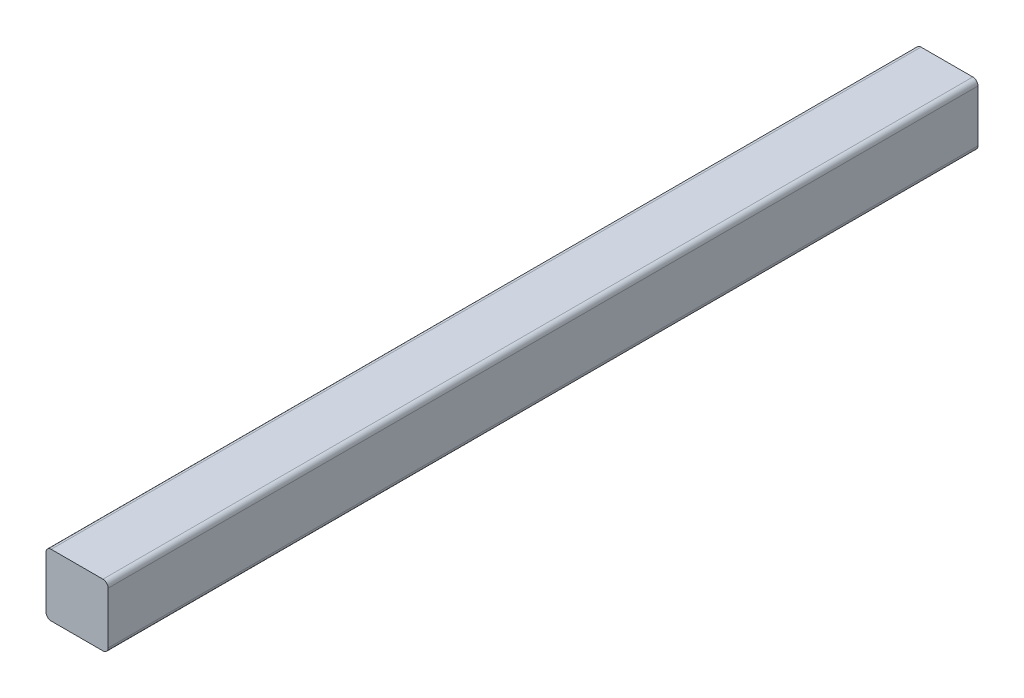
ISO-10303-21;
HEADER;
FILE_DESCRIPTION(('STEP AP214'),'2;1');
FILE_NAME('part.step','',(''),(''),'','','');
FILE_SCHEMA(('AUTOMOTIVE_DESIGN { 1 0 10303 214 1 1 1 1 }'));
ENDSEC;
DATA;
#1=APPLICATION_CONTEXT('core data for automotive mechanical design processes');
#2=APPLICATION_PROTOCOL_DEFINITION('international standard','automotive_design',2000,#1);
#3=PRODUCT_CONTEXT('',#1,'mechanical');
#4=PRODUCT('Part','Part','',(#3));
#5=PRODUCT_RELATED_PRODUCT_CATEGORY('part','',(#4));
#6=PRODUCT_DEFINITION_FORMATION('','',#4);
#7=PRODUCT_DEFINITION_CONTEXT('part definition',#1,'design');
#8=PRODUCT_DEFINITION('design','',#6,#7);
#9=PRODUCT_DEFINITION_SHAPE('','',#8);
#10=(LENGTH_UNIT() NAMED_UNIT(*) SI_UNIT(.MILLI.,.METRE.));
#11=(NAMED_UNIT(*) PLANE_ANGLE_UNIT() SI_UNIT($,.RADIAN.));
#12=(NAMED_UNIT(*) SI_UNIT($,.STERADIAN.) SOLID_ANGLE_UNIT());
#13=UNCERTAINTY_MEASURE_WITH_UNIT(LENGTH_MEASURE(1.E-05),#10,'distance_accuracy_value','');
#14=(GEOMETRIC_REPRESENTATION_CONTEXT(3) GLOBAL_UNCERTAINTY_ASSIGNED_CONTEXT((#13)) GLOBAL_UNIT_ASSIGNED_CONTEXT((#10,
#11,#12)) REPRESENTATION_CONTEXT('',''));
#15=CARTESIAN_POINT('',(0.,0.,0.));
#16=DIRECTION('',(0.,0.,1.));
#17=DIRECTION('',(1.,0.,0.));
#18=AXIS2_PLACEMENT_3D('',#15,#16,#17);
#19=CARTESIAN_POINT('',(19.05,-19.05,533.4));
#20=DIRECTION('',(-1.,0.,0.));
#21=DIRECTION('',(0.,0.,1.));
#22=AXIS2_PLACEMENT_3D('',#19,#20,#21);
#23=PLANE('',#22);
#24=DIRECTION('',(0.,1.,0.));
#25=VECTOR('',#24,1.);
#26=CARTESIAN_POINT('',(19.05,-19.05,533.4));
#27=LINE('',#26,#25);
#28=CARTESIAN_POINT('',(19.05,-15.875,533.4));
#29=VERTEX_POINT('',#28);
#30=CARTESIAN_POINT('',(19.05,15.875,533.4));
#31=VERTEX_POINT('',#30);
#32=EDGE_CURVE('E134',#29,#31,#27,.T.);
#33=ORIENTED_EDGE('',*,*,#32,.F.);
#34=DIRECTION('',(0.,0.,-1.));
#35=VECTOR('',#34,1.);
#36=CARTESIAN_POINT('',(19.05,-15.875,533.4));
#37=LINE('',#36,#35);
#38=CARTESIAN_POINT('',(19.05,-15.875,0.));
#39=VERTEX_POINT('',#38);
#40=EDGE_CURVE('E11',#29,#39,#37,.T.);
#41=ORIENTED_EDGE('',*,*,#40,.T.);
#42=DIRECTION('',(0.,1.,0.));
#43=VECTOR('',#42,1.);
#44=CARTESIAN_POINT('',(19.05,-19.05,0.));
#45=LINE('',#44,#43);
#46=CARTESIAN_POINT('',(19.05,15.875,0.));
#47=VERTEX_POINT('',#46);
#48=EDGE_CURVE('E136',#39,#47,#45,.T.);
#49=ORIENTED_EDGE('',*,*,#48,.T.);
#50=DIRECTION('',(0.,0.,-1.));
#51=VECTOR('',#50,1.);
#52=CARTESIAN_POINT('',(19.05,15.875,533.4));
#53=LINE('',#52,#51);
#54=EDGE_CURVE('E47',#47,#31,#53,.F.);
#55=ORIENTED_EDGE('',*,*,#54,.T.);
#56=EDGE_LOOP('',(#33,#41,#49,#55));
#57=FACE_BOUND('',#56,.T.);
#58=ADVANCED_FACE('F39',(#57),#23,.F.);
#59=CARTESIAN_POINT('',(-19.05,19.05,533.4));
#60=DIRECTION('',(0.,-1.,0.));
#61=DIRECTION('',(0.,0.,-1.));
#62=AXIS2_PLACEMENT_3D('',#59,#60,#61);
#63=PLANE('',#62);
#64=DIRECTION('',(-1.,0.,0.));
#65=VECTOR('',#64,1.);
#66=CARTESIAN_POINT('',(-19.05,19.05,0.));
#67=LINE('',#66,#65);
#68=CARTESIAN_POINT('',(15.875,19.05,0.));
#69=VERTEX_POINT('',#68);
#70=CARTESIAN_POINT('',(-15.875,19.05,0.));
#71=VERTEX_POINT('',#70);
#72=EDGE_CURVE('E132',#69,#71,#67,.T.);
#73=ORIENTED_EDGE('',*,*,#72,.T.);
#74=DIRECTION('',(0.,0.,-1.));
#75=VECTOR('',#74,1.);
#76=CARTESIAN_POINT('',(-15.875,19.05,533.4));
#77=LINE('',#76,#75);
#78=CARTESIAN_POINT('',(-15.875,19.05,533.4));
#79=VERTEX_POINT('',#78);
#80=EDGE_CURVE('E111',#71,#79,#77,.F.);
#81=ORIENTED_EDGE('',*,*,#80,.T.);
#82=DIRECTION('',(-1.,0.,0.));
#83=VECTOR('',#82,1.);
#84=CARTESIAN_POINT('',(-19.05,19.05,533.4));
#85=LINE('',#84,#83);
#86=CARTESIAN_POINT('',(15.875,19.05,533.4));
#87=VERTEX_POINT('',#86);
#88=EDGE_CURVE('E172',#87,#79,#85,.T.);
#89=ORIENTED_EDGE('',*,*,#88,.F.);
#90=DIRECTION('',(0.,0.,-1.));
#91=VECTOR('',#90,1.);
#92=CARTESIAN_POINT('',(15.875,19.05,533.4));
#93=LINE('',#92,#91);
#94=EDGE_CURVE('E116',#87,#69,#93,.T.);
#95=ORIENTED_EDGE('',*,*,#94,.T.);
#96=EDGE_LOOP('',(#73,#81,#89,#95));
#97=FACE_BOUND('',#96,.T.);
#98=ADVANCED_FACE('F176',(#97),#63,.F.);
#99=CARTESIAN_POINT('',(-19.05,-19.05,533.4));
#100=DIRECTION('',(1.,0.,0.));
#101=DIRECTION('',(0.,0.,-1.));
#102=AXIS2_PLACEMENT_3D('',#99,#100,#101);
#103=PLANE('',#102);
#104=DIRECTION('',(0.,-1.,0.));
#105=VECTOR('',#104,1.);
#106=CARTESIAN_POINT('',(-19.05,-19.05,533.4));
#107=LINE('',#106,#105);
#108=CARTESIAN_POINT('',(-19.05,15.875,533.4));
#109=VERTEX_POINT('',#108);
#110=CARTESIAN_POINT('',(-19.05,-15.875,533.4));
#111=VERTEX_POINT('',#110);
#112=EDGE_CURVE('E125',#109,#111,#107,.T.);
#113=ORIENTED_EDGE('',*,*,#112,.F.);
#114=DIRECTION('',(0.,0.,-1.));
#115=VECTOR('',#114,1.);
#116=CARTESIAN_POINT('',(-19.05,15.875,533.4));
#117=LINE('',#116,#115);
#118=CARTESIAN_POINT('',(-19.05,15.875,0.));
#119=VERTEX_POINT('',#118);
#120=EDGE_CURVE('E110',#109,#119,#117,.T.);
#121=ORIENTED_EDGE('',*,*,#120,.T.);
#122=DIRECTION('',(0.,-1.,0.));
#123=VECTOR('',#122,1.);
#124=CARTESIAN_POINT('',(-19.05,-19.05,0.));
#125=LINE('',#124,#123);
#126=CARTESIAN_POINT('',(-19.05,-15.875,0.));
#127=VERTEX_POINT('',#126);
#128=EDGE_CURVE('E123',#119,#127,#125,.T.);
#129=ORIENTED_EDGE('',*,*,#128,.T.);
#130=DIRECTION('',(0.,0.,-1.));
#131=VECTOR('',#130,1.);
#132=CARTESIAN_POINT('',(-19.05,-15.875,533.4));
#133=LINE('',#132,#131);
#134=EDGE_CURVE('E127',#127,#111,#133,.F.);
#135=ORIENTED_EDGE('',*,*,#134,.T.);
#136=EDGE_LOOP('',(#113,#121,#129,#135));
#137=FACE_BOUND('',#136,.T.);
#138=ADVANCED_FACE('F122',(#137),#103,.F.);
#139=CARTESIAN_POINT('',(-19.05,-19.05,533.4));
#140=DIRECTION('',(0.,1.,0.));
#141=DIRECTION('',(0.,0.,1.));
#142=AXIS2_PLACEMENT_3D('',#139,#140,#141);
#143=PLANE('',#142);
#144=DIRECTION('',(1.,0.,0.));
#145=VECTOR('',#144,1.);
#146=CARTESIAN_POINT('',(-19.05,-19.05,533.4));
#147=LINE('',#146,#145);
#148=CARTESIAN_POINT('',(-15.875,-19.05,533.4));
#149=VERTEX_POINT('',#148);
#150=CARTESIAN_POINT('',(15.875,-19.05,533.4));
#151=VERTEX_POINT('',#150);
#152=EDGE_CURVE('E140',#149,#151,#147,.T.);
#153=ORIENTED_EDGE('',*,*,#152,.F.);
#154=DIRECTION('',(0.,0.,-1.));
#155=VECTOR('',#154,1.);
#156=CARTESIAN_POINT('',(-15.875,-19.05,533.4));
#157=LINE('',#156,#155);
#158=CARTESIAN_POINT('',(-15.875,-19.05,0.));
#159=VERTEX_POINT('',#158);
#160=EDGE_CURVE('E157',#149,#159,#157,.T.);
#161=ORIENTED_EDGE('',*,*,#160,.T.);
#162=DIRECTION('',(1.,0.,0.));
#163=VECTOR('',#162,1.);
#164=CARTESIAN_POINT('',(-19.05,-19.05,0.));
#165=LINE('',#164,#163);
#166=CARTESIAN_POINT('',(15.875,-19.05,0.));
#167=VERTEX_POINT('',#166);
#168=EDGE_CURVE('E131',#159,#167,#165,.T.);
#169=ORIENTED_EDGE('',*,*,#168,.T.);
#170=DIRECTION('',(0.,0.,-1.));
#171=VECTOR('',#170,1.);
#172=CARTESIAN_POINT('',(15.875,-19.05,533.4));
#173=LINE('',#172,#171);
#174=EDGE_CURVE('E54',#167,#151,#173,.F.);
#175=ORIENTED_EDGE('',*,*,#174,.T.);
#176=EDGE_LOOP('',(#153,#161,#169,#175));
#177=FACE_BOUND('',#176,.T.);
#178=ADVANCED_FACE('F183',(#177),#143,.F.);
#179=CARTESIAN_POINT('',(0.,0.,533.4));
#180=DIRECTION('',(0.,0.,-1.));
#181=DIRECTION('',(-1.,0.,0.));
#182=AXIS2_PLACEMENT_3D('',#179,#180,#181);
#183=PLANE('',#182);
#184=ORIENTED_EDGE('',*,*,#88,.T.);
#185=CARTESIAN_POINT('',(-15.875,15.875,533.4));
#186=DIRECTION('',(0.,0.,-1.));
#187=DIRECTION('',(-1.,0.,0.));
#188=AXIS2_PLACEMENT_3D('',#185,#186,#187);
#189=CIRCLE('',#188,3.175);
#190=EDGE_CURVE('E154',#79,#109,#189,.F.);
#191=ORIENTED_EDGE('',*,*,#190,.T.);
#192=ORIENTED_EDGE('',*,*,#112,.T.);
#193=CARTESIAN_POINT('',(-15.875,-15.875,533.4));
#194=DIRECTION('',(0.,0.,-1.));
#195=DIRECTION('',(-1.,0.,0.));
#196=AXIS2_PLACEMENT_3D('',#193,#194,#195);
#197=CIRCLE('',#196,3.175);
#198=EDGE_CURVE('E61',#111,#149,#197,.F.);
#199=ORIENTED_EDGE('',*,*,#198,.T.);
#200=ORIENTED_EDGE('',*,*,#152,.T.);
#201=CARTESIAN_POINT('',(15.875,-15.875,533.4));
#202=DIRECTION('',(0.,0.,-1.));
#203=DIRECTION('',(-1.,0.,0.));
#204=AXIS2_PLACEMENT_3D('',#201,#202,#203);
#205=CIRCLE('',#204,3.175);
#206=EDGE_CURVE('E151',#151,#29,#205,.F.);
#207=ORIENTED_EDGE('',*,*,#206,.T.);
#208=ORIENTED_EDGE('',*,*,#32,.T.);
#209=CARTESIAN_POINT('',(15.875,15.875,533.4));
#210=DIRECTION('',(0.,0.,-1.));
#211=DIRECTION('',(-1.,0.,0.));
#212=AXIS2_PLACEMENT_3D('',#209,#210,#211);
#213=CIRCLE('',#212,3.175);
#214=EDGE_CURVE('E149',#31,#87,#213,.F.);
#215=ORIENTED_EDGE('',*,*,#214,.T.);
#216=EDGE_LOOP('',(#184,#191,#192,#199,#200,#207,#208,#215));
#217=FACE_BOUND('',#216,.T.);
#218=ADVANCED_FACE('F169',(#217),#183,.F.);
#219=CARTESIAN_POINT('',(0.,0.,0.));
#220=DIRECTION('',(0.,0.,-1.));
#221=DIRECTION('',(-1.,0.,0.));
#222=AXIS2_PLACEMENT_3D('',#219,#220,#221);
#223=PLANE('',#222);
#224=ORIENTED_EDGE('',*,*,#128,.F.);
#225=CARTESIAN_POINT('',(-15.875,15.875,0.));
#226=DIRECTION('',(0.,0.,-1.));
#227=DIRECTION('',(-1.,0.,0.));
#228=AXIS2_PLACEMENT_3D('',#225,#226,#227);
#229=CIRCLE('',#228,3.175);
#230=EDGE_CURVE('E106',#119,#71,#229,.T.);
#231=ORIENTED_EDGE('',*,*,#230,.T.);
#232=ORIENTED_EDGE('',*,*,#72,.F.);
#233=CARTESIAN_POINT('',(15.875,15.875,0.));
#234=DIRECTION('',(0.,0.,-1.));
#235=DIRECTION('',(-1.,0.,0.));
#236=AXIS2_PLACEMENT_3D('',#233,#234,#235);
#237=CIRCLE('',#236,3.175);
#238=EDGE_CURVE('E126',#69,#47,#237,.T.);
#239=ORIENTED_EDGE('',*,*,#238,.T.);
#240=ORIENTED_EDGE('',*,*,#48,.F.);
#241=CARTESIAN_POINT('',(15.875,-15.875,0.));
#242=DIRECTION('',(0.,0.,-1.));
#243=DIRECTION('',(-1.,0.,0.));
#244=AXIS2_PLACEMENT_3D('',#241,#242,#243);
#245=CIRCLE('',#244,3.175);
#246=EDGE_CURVE('E143',#39,#167,#245,.T.);
#247=ORIENTED_EDGE('',*,*,#246,.T.);
#248=ORIENTED_EDGE('',*,*,#168,.F.);
#249=CARTESIAN_POINT('',(-15.875,-15.875,0.));
#250=DIRECTION('',(0.,0.,-1.));
#251=DIRECTION('',(-1.,0.,0.));
#252=AXIS2_PLACEMENT_3D('',#249,#250,#251);
#253=CIRCLE('',#252,3.175);
#254=EDGE_CURVE('E117',#159,#127,#253,.T.);
#255=ORIENTED_EDGE('',*,*,#254,.T.);
#256=EDGE_LOOP('',(#224,#231,#232,#239,#240,#247,#248,#255));
#257=FACE_BOUND('',#256,.T.);
#258=ADVANCED_FACE('F129',(#257),#223,.T.);
#259=CARTESIAN_POINT('',(-15.875,15.875,533.4));
#260=DIRECTION('',(0.,0.,-1.));
#261=DIRECTION('',(-1.,0.,0.));
#262=AXIS2_PLACEMENT_3D('',#259,#260,#261);
#263=CYLINDRICAL_SURFACE('',#262,3.175);
#264=ORIENTED_EDGE('',*,*,#190,.F.);
#265=ORIENTED_EDGE('',*,*,#80,.F.);
#266=ORIENTED_EDGE('',*,*,#230,.F.);
#267=ORIENTED_EDGE('',*,*,#120,.F.);
#268=EDGE_LOOP('',(#264,#265,#266,#267));
#269=FACE_BOUND('',#268,.T.);
#270=ADVANCED_FACE('F109',(#269),#263,.T.);
#271=CARTESIAN_POINT('',(-15.875,-15.875,533.4));
#272=DIRECTION('',(0.,0.,-1.));
#273=DIRECTION('',(-1.,0.,0.));
#274=AXIS2_PLACEMENT_3D('',#271,#272,#273);
#275=CYLINDRICAL_SURFACE('',#274,3.175);
#276=ORIENTED_EDGE('',*,*,#198,.F.);
#277=ORIENTED_EDGE('',*,*,#134,.F.);
#278=ORIENTED_EDGE('',*,*,#254,.F.);
#279=ORIENTED_EDGE('',*,*,#160,.F.);
#280=EDGE_LOOP('',(#276,#277,#278,#279));
#281=FACE_BOUND('',#280,.T.);
#282=ADVANCED_FACE('F182',(#281),#275,.T.);
#283=CARTESIAN_POINT('',(15.875,-15.875,533.4));
#284=DIRECTION('',(0.,0.,-1.));
#285=DIRECTION('',(-1.,0.,0.));
#286=AXIS2_PLACEMENT_3D('',#283,#284,#285);
#287=CYLINDRICAL_SURFACE('',#286,3.175);
#288=ORIENTED_EDGE('',*,*,#206,.F.);
#289=ORIENTED_EDGE('',*,*,#174,.F.);
#290=ORIENTED_EDGE('',*,*,#246,.F.);
#291=ORIENTED_EDGE('',*,*,#40,.F.);
#292=EDGE_LOOP('',(#288,#289,#290,#291));
#293=FACE_BOUND('',#292,.T.);
#294=ADVANCED_FACE('F185',(#293),#287,.T.);
#295=CARTESIAN_POINT('',(15.875,15.875,533.4));
#296=DIRECTION('',(0.,0.,-1.));
#297=DIRECTION('',(-1.,0.,0.));
#298=AXIS2_PLACEMENT_3D('',#295,#296,#297);
#299=CYLINDRICAL_SURFACE('',#298,3.175);
#300=ORIENTED_EDGE('',*,*,#214,.F.);
#301=ORIENTED_EDGE('',*,*,#54,.F.);
#302=ORIENTED_EDGE('',*,*,#238,.F.);
#303=ORIENTED_EDGE('',*,*,#94,.F.);
#304=EDGE_LOOP('',(#300,#301,#302,#303));
#305=FACE_BOUND('',#304,.T.);
#306=ADVANCED_FACE('F41',(#305),#299,.T.);
#307=CLOSED_SHELL('',(#58,#98,#138,#178,#218,#258,#270,#282,#294,#306));
#308=MANIFOLD_SOLID_BREP('B2',#307);
#309=ADVANCED_BREP_SHAPE_REPRESENTATION('',(#18,#308),#14);
#310=SHAPE_DEFINITION_REPRESENTATION(#9,#309);
ENDSEC;
END-ISO-10303-21;
